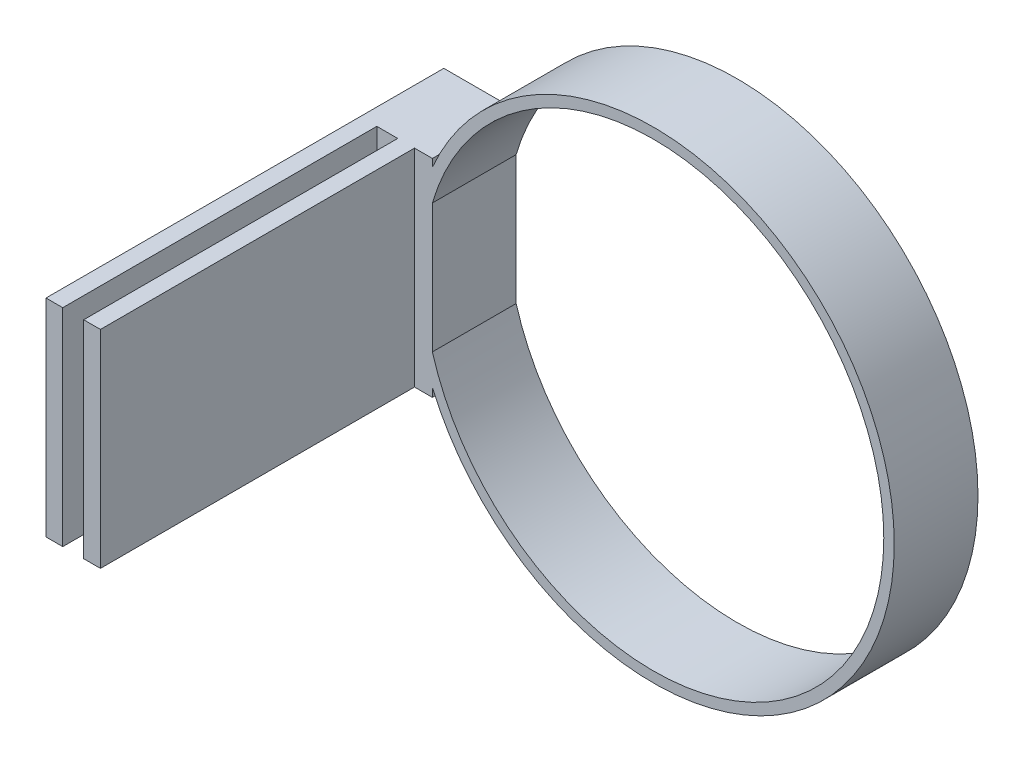
ISO-10303-21;
HEADER;
FILE_DESCRIPTION(('STEP AP214'),'2;1');
FILE_NAME('part.step','',(''),(''),'','','');
FILE_SCHEMA(('AUTOMOTIVE_DESIGN { 1 0 10303 214 1 1 1 1 }'));
ENDSEC;
DATA;
#1=APPLICATION_CONTEXT('core data for automotive mechanical design processes');
#2=APPLICATION_PROTOCOL_DEFINITION('international standard','automotive_design',2000,#1);
#3=PRODUCT_CONTEXT('',#1,'mechanical');
#4=PRODUCT('Part','Part','',(#3));
#5=PRODUCT_RELATED_PRODUCT_CATEGORY('part','',(#4));
#6=PRODUCT_DEFINITION_FORMATION('','',#4);
#7=PRODUCT_DEFINITION_CONTEXT('part definition',#1,'design');
#8=PRODUCT_DEFINITION('design','',#6,#7);
#9=PRODUCT_DEFINITION_SHAPE('','',#8);
#10=(LENGTH_UNIT() NAMED_UNIT(*) SI_UNIT(.MILLI.,.METRE.));
#11=(NAMED_UNIT(*) PLANE_ANGLE_UNIT() SI_UNIT($,.RADIAN.));
#12=(NAMED_UNIT(*) SI_UNIT($,.STERADIAN.) SOLID_ANGLE_UNIT());
#13=UNCERTAINTY_MEASURE_WITH_UNIT(LENGTH_MEASURE(1.E-05),#10,'distance_accuracy_value','');
#14=(GEOMETRIC_REPRESENTATION_CONTEXT(3) GLOBAL_UNCERTAINTY_ASSIGNED_CONTEXT((#13)) GLOBAL_UNIT_ASSIGNED_CONTEXT((#10,
#11,#12)) REPRESENTATION_CONTEXT('',''));
#15=CARTESIAN_POINT('',(0.,0.,0.));
#16=DIRECTION('',(0.,0.,1.));
#17=DIRECTION('',(1.,0.,0.));
#18=AXIS2_PLACEMENT_3D('',#15,#16,#17);
#19=CARTESIAN_POINT('',(0.,0.,20.));
#20=DIRECTION('',(0.,0.,1.));
#21=DIRECTION('',(1.,0.,0.));
#22=AXIS2_PLACEMENT_3D('',#19,#20,#21);
#23=PLANE('',#22);
#24=DIRECTION('',(1.,0.,0.));
#25=VECTOR('',#24,1.);
#26=CARTESIAN_POINT('',(0.,-29.67497994886,20.));
#27=LINE('',#26,#25);
#28=CARTESIAN_POINT('',(-29.4237357199124,-29.67497994886,20.));
#29=VERTEX_POINT('',#28);
#30=CARTESIAN_POINT('',(-24.4237357199124,-29.67497994886,20.));
#31=VERTEX_POINT('',#30);
#32=EDGE_CURVE('E149',#29,#31,#27,.T.);
#33=ORIENTED_EDGE('',*,*,#32,.T.);
#34=DIRECTION('',(0.,-1.,0.));
#35=VECTOR('',#34,1.);
#36=CARTESIAN_POINT('',(-24.4237357199124,19.7502374910473,20.));
#37=LINE('',#36,#35);
#38=CARTESIAN_POINT('',(-24.4237357199124,19.7502374910473,20.));
#39=VERTEX_POINT('',#38);
#40=EDGE_CURVE('E60',#39,#31,#37,.T.);
#41=ORIENTED_EDGE('',*,*,#40,.F.);
#42=DIRECTION('',(1.,0.,0.));
#43=VECTOR('',#42,1.);
#44=CARTESIAN_POINT('',(0.,19.7502374910473,20.));
#45=LINE('',#44,#43);
#46=CARTESIAN_POINT('',(-29.4237357199124,19.7502374910473,20.));
#47=VERTEX_POINT('',#46);
#48=EDGE_CURVE('E150',#47,#39,#45,.T.);
#49=ORIENTED_EDGE('',*,*,#48,.F.);
#50=DIRECTION('',(0.,-1.,0.));
#51=VECTOR('',#50,1.);
#52=CARTESIAN_POINT('',(-29.4237357199124,19.7502374910473,20.));
#53=LINE('',#52,#51);
#54=EDGE_CURVE('E157',#47,#29,#53,.T.);
#55=ORIENTED_EDGE('',*,*,#54,.T.);
#56=EDGE_LOOP('',(#33,#41,#49,#55));
#57=FACE_BOUND('',#56,.T.);
#58=ADVANCED_FACE('F35',(#57),#23,.T.);
#59=DIRECTION('',(0.,-1.,0.));
#60=VECTOR('',#59,1.);
#61=CARTESIAN_POINT('',(-20.4237357199124,19.7502374910473,20.));
#62=LINE('',#61,#60);
#63=CARTESIAN_POINT('',(-20.4237357199124,19.7502374910473,20.));
#64=VERTEX_POINT('',#63);
#65=CARTESIAN_POINT('',(-20.4237357199124,-29.67497994886,20.));
#66=VERTEX_POINT('',#65);
#67=EDGE_CURVE('E153',#64,#66,#62,.T.);
#68=ORIENTED_EDGE('',*,*,#67,.T.);
#69=CARTESIAN_POINT('',(-16.1546838433183,-29.67497994886,20.));
#70=VERTEX_POINT('',#69);
#71=EDGE_CURVE('E139',#66,#70,#27,.T.);
#72=ORIENTED_EDGE('',*,*,#71,.T.);
#73=DIRECTION('',(0.,-1.,0.));
#74=VECTOR('',#73,1.);
#75=CARTESIAN_POINT('',(-16.1546838433183,0.,20.));
#76=LINE('',#75,#74);
#77=CARTESIAN_POINT('',(-16.1546838433183,-27.63260085154,20.));
#78=VERTEX_POINT('',#77);
#79=EDGE_CURVE('E205',#78,#70,#76,.T.);
#80=ORIENTED_EDGE('',*,*,#79,.F.);
#81=CARTESIAN_POINT('',(36.6449460322452,-4.86312380432822,20.));
#82=DIRECTION('',(0.,0.,1.));
#83=DIRECTION('',(1.,0.,0.));
#84=AXIS2_PLACEMENT_3D('',#81,#82,#83);
#85=CIRCLE('',#84,57.5);
#86=CARTESIAN_POINT('',(-16.1546838433183,17.9063532428835,20.));
#87=VERTEX_POINT('',#86);
#88=EDGE_CURVE('E199',#78,#87,#85,.T.);
#89=ORIENTED_EDGE('',*,*,#88,.T.);
#90=CARTESIAN_POINT('',(-16.1546838433183,19.7502374910473,20.));
#91=VERTEX_POINT('',#90);
#92=EDGE_CURVE('E201',#91,#87,#76,.T.);
#93=ORIENTED_EDGE('',*,*,#92,.F.);
#94=EDGE_CURVE('E52',#64,#91,#45,.T.);
#95=ORIENTED_EDGE('',*,*,#94,.F.);
#96=EDGE_LOOP('',(#68,#72,#80,#89,#93,#95));
#97=FACE_BOUND('',#96,.T.);
#98=CARTESIAN_POINT('',(36.6449460322452,-4.86312380432822,20.));
#99=DIRECTION('',(0.,0.,1.));
#100=DIRECTION('',(1.,0.,0.));
#101=AXIS2_PLACEMENT_3D('',#98,#99,#100);
#102=CIRCLE('',#101,55.);
#103=CARTESIAN_POINT('',(-16.1546838433183,-20.2643927456688,20.));
#104=VERTEX_POINT('',#103);
#105=CARTESIAN_POINT('',(-16.1546838433183,10.5381451370124,20.));
#106=VERTEX_POINT('',#105);
#107=EDGE_CURVE('E207',#104,#106,#102,.T.);
#108=ORIENTED_EDGE('',*,*,#107,.F.);
#109=DIRECTION('',(0.,-1.,0.));
#110=VECTOR('',#109,1.);
#111=CARTESIAN_POINT('',(-16.1546838433183,0.,20.));
#112=LINE('',#111,#110);
#113=EDGE_CURVE('E210',#106,#104,#112,.T.);
#114=ORIENTED_EDGE('',*,*,#113,.F.);
#115=EDGE_LOOP('',(#108,#114));
#116=FACE_BOUND('',#115,.T.);
#117=ADVANCED_FACE('F154',(#97,#116),#23,.T.);
#118=CARTESIAN_POINT('',(36.6449460322452,-4.86312380432822,20.));
#119=DIRECTION('',(0.,0.,-1.));
#120=DIRECTION('',(-1.,0.,0.));
#121=AXIS2_PLACEMENT_3D('',#118,#119,#120);
#122=CYLINDRICAL_SURFACE('',#121,55.);
#123=CARTESIAN_POINT('',(36.6449460322452,-4.86312380432822,0.));
#124=DIRECTION('',(0.,0.,1.));
#125=DIRECTION('',(1.,0.,0.));
#126=AXIS2_PLACEMENT_3D('',#123,#124,#125);
#127=CIRCLE('',#126,55.);
#128=CARTESIAN_POINT('',(-16.1546838433183,-20.2643927456688,0.));
#129=VERTEX_POINT('',#128);
#130=CARTESIAN_POINT('',(-16.1546838433183,10.5381451370124,0.));
#131=VERTEX_POINT('',#130);
#132=EDGE_CURVE('E227',#129,#131,#127,.T.);
#133=ORIENTED_EDGE('',*,*,#132,.F.);
#134=DIRECTION('',(0.,0.,-1.));
#135=VECTOR('',#134,1.);
#136=CARTESIAN_POINT('',(-16.1546838433183,-20.2643927456688,20.));
#137=LINE('',#136,#135);
#138=EDGE_CURVE('E11',#104,#129,#137,.T.);
#139=ORIENTED_EDGE('',*,*,#138,.F.);
#140=ORIENTED_EDGE('',*,*,#107,.T.);
#141=DIRECTION('',(0.,0.,-1.));
#142=VECTOR('',#141,1.);
#143=CARTESIAN_POINT('',(-16.1546838433183,10.5381451370124,20.));
#144=LINE('',#143,#142);
#145=EDGE_CURVE('E44',#106,#131,#144,.T.);
#146=ORIENTED_EDGE('',*,*,#145,.T.);
#147=EDGE_LOOP('',(#133,#139,#140,#146));
#148=FACE_BOUND('',#147,.T.);
#149=ADVANCED_FACE('F285',(#148),#122,.F.);
#150=CARTESIAN_POINT('',(36.6449460322452,-4.86312380432822,20.));
#151=DIRECTION('',(0.,0.,-1.));
#152=DIRECTION('',(-1.,0.,0.));
#153=AXIS2_PLACEMENT_3D('',#150,#151,#152);
#154=CYLINDRICAL_SURFACE('',#153,57.5);
#155=CARTESIAN_POINT('',(36.6449460322452,-4.86312380432822,0.));
#156=DIRECTION('',(0.,0.,1.));
#157=DIRECTION('',(1.,0.,0.));
#158=AXIS2_PLACEMENT_3D('',#155,#156,#157);
#159=CIRCLE('',#158,57.5);
#160=CARTESIAN_POINT('',(-16.1546838433183,-27.63260085154,0.));
#161=VERTEX_POINT('',#160);
#162=CARTESIAN_POINT('',(-16.1546838433183,17.9063532428835,0.));
#163=VERTEX_POINT('',#162);
#164=EDGE_CURVE('E198',#161,#163,#159,.T.);
#165=ORIENTED_EDGE('',*,*,#164,.T.);
#166=DIRECTION('',(0.,0.,-1.));
#167=VECTOR('',#166,1.);
#168=CARTESIAN_POINT('',(-16.1546838433183,17.9063532428835,20.));
#169=LINE('',#168,#167);
#170=EDGE_CURVE('E39',#87,#163,#169,.T.);
#171=ORIENTED_EDGE('',*,*,#170,.F.);
#172=ORIENTED_EDGE('',*,*,#88,.F.);
#173=DIRECTION('',(0.,0.,-1.));
#174=VECTOR('',#173,1.);
#175=CARTESIAN_POINT('',(-16.1546838433183,-27.63260085154,20.));
#176=LINE('',#175,#174);
#177=EDGE_CURVE('E213',#78,#161,#176,.T.);
#178=ORIENTED_EDGE('',*,*,#177,.T.);
#179=EDGE_LOOP('',(#165,#171,#172,#178));
#180=FACE_BOUND('',#179,.T.);
#181=ADVANCED_FACE('F37',(#180),#154,.T.);
#182=CARTESIAN_POINT('',(-16.1546838433183,0.,20.));
#183=DIRECTION('',(1.,0.,0.));
#184=DIRECTION('',(0.,0.,-1.));
#185=AXIS2_PLACEMENT_3D('',#182,#183,#184);
#186=PLANE('',#185);
#187=DIRECTION('',(0.,-1.,0.));
#188=VECTOR('',#187,1.);
#189=CARTESIAN_POINT('',(-16.1546838433183,0.,0.));
#190=LINE('',#189,#188);
#191=CARTESIAN_POINT('',(-16.1546838433183,19.7502374910473,0.));
#192=VERTEX_POINT('',#191);
#193=EDGE_CURVE('E216',#192,#163,#190,.T.);
#194=ORIENTED_EDGE('',*,*,#193,.F.);
#195=DIRECTION('',(0.,0.,-1.));
#196=VECTOR('',#195,1.);
#197=CARTESIAN_POINT('',(-16.1546838433183,19.7502374910473,20.));
#198=LINE('',#197,#196);
#199=EDGE_CURVE('E239',#91,#192,#198,.T.);
#200=ORIENTED_EDGE('',*,*,#199,.F.);
#201=ORIENTED_EDGE('',*,*,#92,.T.);
#202=ORIENTED_EDGE('',*,*,#170,.T.);
#203=EDGE_LOOP('',(#194,#200,#201,#202));
#204=FACE_BOUND('',#203,.T.);
#205=ADVANCED_FACE('F246',(#204),#186,.T.);
#206=CARTESIAN_POINT('',(0.,19.7502374910473,20.));
#207=DIRECTION('',(0.,1.,0.));
#208=DIRECTION('',(0.,0.,1.));
#209=AXIS2_PLACEMENT_3D('',#206,#207,#208);
#210=PLANE('',#209);
#211=DIRECTION('',(1.,0.,0.));
#212=VECTOR('',#211,1.);
#213=CARTESIAN_POINT('',(0.,19.7502374910473,0.));
#214=LINE('',#213,#212);
#215=CARTESIAN_POINT('',(-33.4237357199124,19.7502374910473,0.));
#216=VERTEX_POINT('',#215);
#217=EDGE_CURVE('E219',#216,#192,#214,.T.);
#218=ORIENTED_EDGE('',*,*,#217,.F.);
#219=DIRECTION('',(0.,0.,-1.));
#220=VECTOR('',#219,1.);
#221=CARTESIAN_POINT('',(-33.4237357199124,19.7502374910473,20.));
#222=LINE('',#221,#220);
#223=CARTESIAN_POINT('',(-33.4237357199124,19.7502374910473,95.));
#224=VERTEX_POINT('',#223);
#225=EDGE_CURVE('E238',#224,#216,#222,.T.);
#226=ORIENTED_EDGE('',*,*,#225,.F.);
#227=DIRECTION('',(1.,0.,0.));
#228=VECTOR('',#227,1.);
#229=CARTESIAN_POINT('',(-33.4237357199124,19.7502374910473,95.));
#230=LINE('',#229,#228);
#231=CARTESIAN_POINT('',(-29.4237357199124,19.7502374910473,95.));
#232=VERTEX_POINT('',#231);
#233=EDGE_CURVE('E186',#224,#232,#230,.T.);
#234=ORIENTED_EDGE('',*,*,#233,.T.);
#235=DIRECTION('',(0.,0.,-1.));
#236=VECTOR('',#235,1.);
#237=CARTESIAN_POINT('',(-29.4237357199124,19.7502374910473,95.));
#238=LINE('',#237,#236);
#239=EDGE_CURVE('E192',#232,#47,#238,.T.);
#240=ORIENTED_EDGE('',*,*,#239,.T.);
#241=ORIENTED_EDGE('',*,*,#48,.T.);
#242=DIRECTION('',(0.,0.,-1.));
#243=VECTOR('',#242,1.);
#244=CARTESIAN_POINT('',(-24.4237357199124,19.7502374910473,95.));
#245=LINE('',#244,#243);
#246=CARTESIAN_POINT('',(-24.4237357199124,19.7502374910473,95.));
#247=VERTEX_POINT('',#246);
#248=EDGE_CURVE('E164',#247,#39,#245,.T.);
#249=ORIENTED_EDGE('',*,*,#248,.F.);
#250=DIRECTION('',(1.,0.,0.));
#251=VECTOR('',#250,1.);
#252=CARTESIAN_POINT('',(-24.4237357199124,19.7502374910473,95.));
#253=LINE('',#252,#251);
#254=CARTESIAN_POINT('',(-20.4237357199124,19.7502374910473,95.));
#255=VERTEX_POINT('',#254);
#256=EDGE_CURVE('E176',#247,#255,#253,.T.);
#257=ORIENTED_EDGE('',*,*,#256,.T.);
#258=DIRECTION('',(0.,0.,-1.));
#259=VECTOR('',#258,1.);
#260=CARTESIAN_POINT('',(-20.4237357199124,19.7502374910473,95.));
#261=LINE('',#260,#259);
#262=EDGE_CURVE('E162',#255,#64,#261,.T.);
#263=ORIENTED_EDGE('',*,*,#262,.T.);
#264=ORIENTED_EDGE('',*,*,#94,.T.);
#265=ORIENTED_EDGE('',*,*,#199,.T.);
#266=EDGE_LOOP('',(#218,#226,#234,#240,#241,#249,#257,#263,#264,#265));
#267=FACE_BOUND('',#266,.T.);
#268=ADVANCED_FACE('F257',(#267),#210,.T.);
#269=CARTESIAN_POINT('',(-33.4237357199124,0.,20.));
#270=DIRECTION('',(1.,0.,0.));
#271=DIRECTION('',(0.,0.,-1.));
#272=AXIS2_PLACEMENT_3D('',#269,#270,#271);
#273=PLANE('',#272);
#274=DIRECTION('',(0.,-1.,0.));
#275=VECTOR('',#274,1.);
#276=CARTESIAN_POINT('',(-33.4237357199124,0.,0.));
#277=LINE('',#276,#275);
#278=CARTESIAN_POINT('',(-33.4237357199124,-29.67497994886,0.));
#279=VERTEX_POINT('',#278);
#280=EDGE_CURVE('E223',#216,#279,#277,.T.);
#281=ORIENTED_EDGE('',*,*,#280,.T.);
#282=DIRECTION('',(0.,0.,-1.));
#283=VECTOR('',#282,1.);
#284=CARTESIAN_POINT('',(-33.4237357199124,-29.67497994886,20.));
#285=LINE('',#284,#283);
#286=CARTESIAN_POINT('',(-33.4237357199124,-29.67497994886,95.));
#287=VERTEX_POINT('',#286);
#288=EDGE_CURVE('E235',#287,#279,#285,.T.);
#289=ORIENTED_EDGE('',*,*,#288,.F.);
#290=DIRECTION('',(0.,-1.,0.));
#291=VECTOR('',#290,1.);
#292=CARTESIAN_POINT('',(-33.4237357199124,19.7502374910473,95.));
#293=LINE('',#292,#291);
#294=EDGE_CURVE('E189',#224,#287,#293,.T.);
#295=ORIENTED_EDGE('',*,*,#294,.F.);
#296=ORIENTED_EDGE('',*,*,#225,.T.);
#297=EDGE_LOOP('',(#281,#289,#295,#296));
#298=FACE_BOUND('',#297,.T.);
#299=ADVANCED_FACE('F261',(#298),#273,.F.);
#300=CARTESIAN_POINT('',(0.,-29.67497994886,20.));
#301=DIRECTION('',(0.,1.,0.));
#302=DIRECTION('',(0.,0.,1.));
#303=AXIS2_PLACEMENT_3D('',#300,#301,#302);
#304=PLANE('',#303);
#305=DIRECTION('',(1.,0.,0.));
#306=VECTOR('',#305,1.);
#307=CARTESIAN_POINT('',(0.,-29.67497994886,0.));
#308=LINE('',#307,#306);
#309=CARTESIAN_POINT('',(-16.1546838433183,-29.67497994886,0.));
#310=VERTEX_POINT('',#309);
#311=EDGE_CURVE('E225',#279,#310,#308,.T.);
#312=ORIENTED_EDGE('',*,*,#311,.T.);
#313=DIRECTION('',(0.,0.,-1.));
#314=VECTOR('',#313,1.);
#315=CARTESIAN_POINT('',(-16.1546838433183,-29.67497994886,20.));
#316=LINE('',#315,#314);
#317=EDGE_CURVE('E146',#70,#310,#316,.T.);
#318=ORIENTED_EDGE('',*,*,#317,.F.);
#319=ORIENTED_EDGE('',*,*,#71,.F.);
#320=DIRECTION('',(0.,0.,-1.));
#321=VECTOR('',#320,1.);
#322=CARTESIAN_POINT('',(-20.4237357199124,-29.67497994886,95.));
#323=LINE('',#322,#321);
#324=CARTESIAN_POINT('',(-20.4237357199124,-29.67497994886,95.));
#325=VERTEX_POINT('',#324);
#326=EDGE_CURVE('E144',#325,#66,#323,.T.);
#327=ORIENTED_EDGE('',*,*,#326,.F.);
#328=DIRECTION('',(1.,0.,0.));
#329=VECTOR('',#328,1.);
#330=CARTESIAN_POINT('',(-24.4237357199124,-29.67497994886,95.));
#331=LINE('',#330,#329);
#332=CARTESIAN_POINT('',(-24.4237357199124,-29.67497994886,95.));
#333=VERTEX_POINT('',#332);
#334=EDGE_CURVE('E173',#333,#325,#331,.T.);
#335=ORIENTED_EDGE('',*,*,#334,.F.);
#336=DIRECTION('',(0.,0.,-1.));
#337=VECTOR('',#336,1.);
#338=CARTESIAN_POINT('',(-24.4237357199124,-29.67497994886,95.));
#339=LINE('',#338,#337);
#340=EDGE_CURVE('E169',#333,#31,#339,.T.);
#341=ORIENTED_EDGE('',*,*,#340,.T.);
#342=ORIENTED_EDGE('',*,*,#32,.F.);
#343=DIRECTION('',(0.,0.,-1.));
#344=VECTOR('',#343,1.);
#345=CARTESIAN_POINT('',(-29.4237357199124,-29.67497994886,95.));
#346=LINE('',#345,#344);
#347=CARTESIAN_POINT('',(-29.4237357199124,-29.67497994886,95.));
#348=VERTEX_POINT('',#347);
#349=EDGE_CURVE('E196',#348,#29,#346,.T.);
#350=ORIENTED_EDGE('',*,*,#349,.F.);
#351=DIRECTION('',(1.,0.,0.));
#352=VECTOR('',#351,1.);
#353=CARTESIAN_POINT('',(-33.4237357199124,-29.67497994886,95.));
#354=LINE('',#353,#352);
#355=EDGE_CURVE('E181',#287,#348,#354,.T.);
#356=ORIENTED_EDGE('',*,*,#355,.F.);
#357=ORIENTED_EDGE('',*,*,#288,.T.);
#358=EDGE_LOOP('',(#312,#318,#319,#327,#335,#341,#342,#350,#356,#357));
#359=FACE_BOUND('',#358,.T.);
#360=ADVANCED_FACE('F141',(#359),#304,.F.);
#361=EDGE_CURVE('E220',#161,#310,#190,.T.);
#362=ORIENTED_EDGE('',*,*,#361,.F.);
#363=ORIENTED_EDGE('',*,*,#177,.F.);
#364=ORIENTED_EDGE('',*,*,#79,.T.);
#365=ORIENTED_EDGE('',*,*,#317,.T.);
#366=EDGE_LOOP('',(#362,#363,#364,#365));
#367=FACE_BOUND('',#366,.T.);
#368=ADVANCED_FACE('F278',(#367),#186,.T.);
#369=CARTESIAN_POINT('',(-16.1546838433183,0.,20.));
#370=DIRECTION('',(1.,0.,0.));
#371=DIRECTION('',(0.,0.,-1.));
#372=AXIS2_PLACEMENT_3D('',#369,#370,#371);
#373=PLANE('',#372);
#374=DIRECTION('',(0.,-1.,0.));
#375=VECTOR('',#374,1.);
#376=CARTESIAN_POINT('',(-16.1546838433183,0.,0.));
#377=LINE('',#376,#375);
#378=EDGE_CURVE('E202',#131,#129,#377,.T.);
#379=ORIENTED_EDGE('',*,*,#378,.F.);
#380=ORIENTED_EDGE('',*,*,#145,.F.);
#381=ORIENTED_EDGE('',*,*,#113,.T.);
#382=ORIENTED_EDGE('',*,*,#138,.T.);
#383=EDGE_LOOP('',(#379,#380,#381,#382));
#384=FACE_BOUND('',#383,.T.);
#385=ADVANCED_FACE('F291',(#384),#373,.T.);
#386=CARTESIAN_POINT('',(0.,0.,0.));
#387=DIRECTION('',(0.,0.,1.));
#388=DIRECTION('',(1.,0.,0.));
#389=AXIS2_PLACEMENT_3D('',#386,#387,#388);
#390=PLANE('',#389);
#391=ORIENTED_EDGE('',*,*,#164,.F.);
#392=ORIENTED_EDGE('',*,*,#361,.T.);
#393=ORIENTED_EDGE('',*,*,#311,.F.);
#394=ORIENTED_EDGE('',*,*,#280,.F.);
#395=ORIENTED_EDGE('',*,*,#217,.T.);
#396=ORIENTED_EDGE('',*,*,#193,.T.);
#397=EDGE_LOOP('',(#391,#392,#393,#394,#395,#396));
#398=FACE_BOUND('',#397,.T.);
#399=ORIENTED_EDGE('',*,*,#132,.T.);
#400=ORIENTED_EDGE('',*,*,#378,.T.);
#401=EDGE_LOOP('',(#399,#400));
#402=FACE_BOUND('',#401,.T.);
#403=ADVANCED_FACE('F253',(#398,#402),#390,.F.);
#404=CARTESIAN_POINT('',(-29.4237357199124,19.7502374910473,95.));
#405=DIRECTION('',(1.,0.,0.));
#406=DIRECTION('',(0.,1.,0.));
#407=AXIS2_PLACEMENT_3D('',#404,#405,#406);
#408=PLANE('',#407);
#409=ORIENTED_EDGE('',*,*,#54,.F.);
#410=ORIENTED_EDGE('',*,*,#239,.F.);
#411=DIRECTION('',(0.,-1.,0.));
#412=VECTOR('',#411,1.);
#413=CARTESIAN_POINT('',(-29.4237357199124,19.7502374910473,95.));
#414=LINE('',#413,#412);
#415=EDGE_CURVE('E183',#232,#348,#414,.T.);
#416=ORIENTED_EDGE('',*,*,#415,.T.);
#417=ORIENTED_EDGE('',*,*,#349,.T.);
#418=EDGE_LOOP('',(#409,#410,#416,#417));
#419=FACE_BOUND('',#418,.T.);
#420=ADVANCED_FACE('F269',(#419),#408,.T.);
#421=CARTESIAN_POINT('',(0.,0.,95.));
#422=DIRECTION('',(0.,0.,-1.));
#423=DIRECTION('',(-1.,0.,0.));
#424=AXIS2_PLACEMENT_3D('',#421,#422,#423);
#425=PLANE('',#424);
#426=ORIENTED_EDGE('',*,*,#355,.T.);
#427=ORIENTED_EDGE('',*,*,#415,.F.);
#428=ORIENTED_EDGE('',*,*,#233,.F.);
#429=ORIENTED_EDGE('',*,*,#294,.T.);
#430=EDGE_LOOP('',(#426,#427,#428,#429));
#431=FACE_BOUND('',#430,.T.);
#432=ADVANCED_FACE('F265',(#431),#425,.F.);
#433=CARTESIAN_POINT('',(-20.4237357199124,19.7502374910473,95.));
#434=DIRECTION('',(1.,0.,0.));
#435=DIRECTION('',(0.,1.,0.));
#436=AXIS2_PLACEMENT_3D('',#433,#434,#435);
#437=PLANE('',#436);
#438=ORIENTED_EDGE('',*,*,#67,.F.);
#439=ORIENTED_EDGE('',*,*,#262,.F.);
#440=DIRECTION('',(0.,-1.,0.));
#441=VECTOR('',#440,1.);
#442=CARTESIAN_POINT('',(-20.4237357199124,19.7502374910473,95.));
#443=LINE('',#442,#441);
#444=EDGE_CURVE('E161',#255,#325,#443,.T.);
#445=ORIENTED_EDGE('',*,*,#444,.T.);
#446=ORIENTED_EDGE('',*,*,#326,.T.);
#447=EDGE_LOOP('',(#438,#439,#445,#446));
#448=FACE_BOUND('',#447,.T.);
#449=ADVANCED_FACE('F159',(#448),#437,.T.);
#450=CARTESIAN_POINT('',(-24.4237357199124,19.7502374910473,95.));
#451=DIRECTION('',(1.,0.,0.));
#452=DIRECTION('',(0.,1.,0.));
#453=AXIS2_PLACEMENT_3D('',#450,#451,#452);
#454=PLANE('',#453);
#455=ORIENTED_EDGE('',*,*,#40,.T.);
#456=ORIENTED_EDGE('',*,*,#340,.F.);
#457=DIRECTION('',(0.,-1.,0.));
#458=VECTOR('',#457,1.);
#459=CARTESIAN_POINT('',(-24.4237357199124,19.7502374910473,95.));
#460=LINE('',#459,#458);
#461=EDGE_CURVE('E172',#247,#333,#460,.T.);
#462=ORIENTED_EDGE('',*,*,#461,.F.);
#463=ORIENTED_EDGE('',*,*,#248,.T.);
#464=EDGE_LOOP('',(#455,#456,#462,#463));
#465=FACE_BOUND('',#464,.T.);
#466=ADVANCED_FACE('F272',(#465),#454,.F.);
#467=CARTESIAN_POINT('',(0.,0.,95.));
#468=DIRECTION('',(0.,0.,-1.));
#469=DIRECTION('',(-1.,0.,0.));
#470=AXIS2_PLACEMENT_3D('',#467,#468,#469);
#471=PLANE('',#470);
#472=ORIENTED_EDGE('',*,*,#334,.T.);
#473=ORIENTED_EDGE('',*,*,#444,.F.);
#474=ORIENTED_EDGE('',*,*,#256,.F.);
#475=ORIENTED_EDGE('',*,*,#461,.T.);
#476=EDGE_LOOP('',(#472,#473,#474,#475));
#477=FACE_BOUND('',#476,.T.);
#478=ADVANCED_FACE('F276',(#477),#471,.F.);
#479=CLOSED_SHELL('',(#58,#117,#149,#181,#205,#268,#299,#360,#368,#385,#403,#420,#432,#449,#466,#478));
#480=MANIFOLD_SOLID_BREP('B2',#479);
#481=ADVANCED_BREP_SHAPE_REPRESENTATION('',(#18,#480),#14);
#482=SHAPE_DEFINITION_REPRESENTATION(#9,#481);
ENDSEC;
END-ISO-10303-21;
